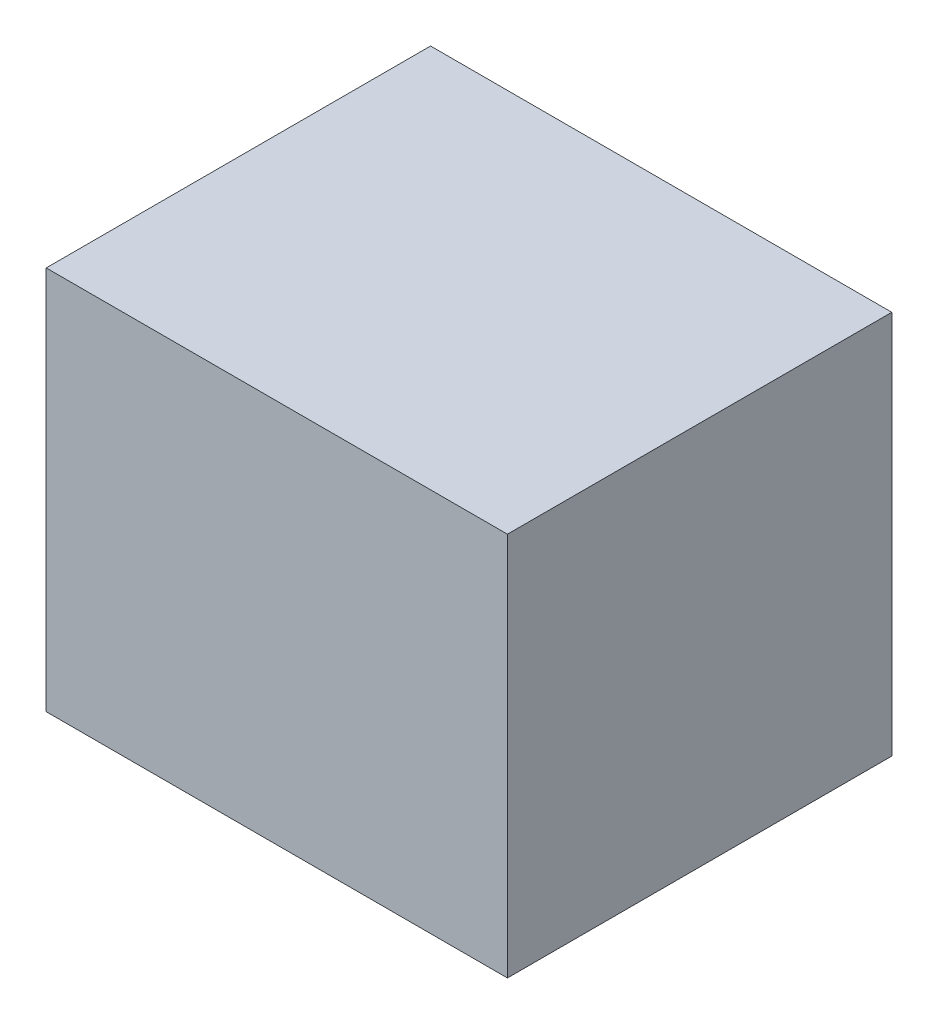
ISO-10303-21;
HEADER;
FILE_DESCRIPTION(('STEP AP214'),'2;1');
FILE_NAME('part.step','',(''),(''),'','','');
FILE_SCHEMA(('AUTOMOTIVE_DESIGN { 1 0 10303 214 1 1 1 1 }'));
ENDSEC;
DATA;
#1=APPLICATION_CONTEXT('core data for automotive mechanical design processes');
#2=APPLICATION_PROTOCOL_DEFINITION('international standard','automotive_design',2000,#1);
#3=PRODUCT_CONTEXT('',#1,'mechanical');
#4=PRODUCT('Part','Part','',(#3));
#5=PRODUCT_RELATED_PRODUCT_CATEGORY('part','',(#4));
#6=PRODUCT_DEFINITION_FORMATION('','',#4);
#7=PRODUCT_DEFINITION_CONTEXT('part definition',#1,'design');
#8=PRODUCT_DEFINITION('design','',#6,#7);
#9=PRODUCT_DEFINITION_SHAPE('','',#8);
#10=(LENGTH_UNIT() NAMED_UNIT(*) SI_UNIT(.MILLI.,.METRE.));
#11=(NAMED_UNIT(*) PLANE_ANGLE_UNIT() SI_UNIT($,.RADIAN.));
#12=(NAMED_UNIT(*) SI_UNIT($,.STERADIAN.) SOLID_ANGLE_UNIT());
#13=UNCERTAINTY_MEASURE_WITH_UNIT(LENGTH_MEASURE(1.E-05),#10,'distance_accuracy_value','');
#14=(GEOMETRIC_REPRESENTATION_CONTEXT(3) GLOBAL_UNCERTAINTY_ASSIGNED_CONTEXT((#13)) GLOBAL_UNIT_ASSIGNED_CONTEXT((#10,
#11,#12)) REPRESENTATION_CONTEXT('',''));
#15=CARTESIAN_POINT('',(0.,0.,0.));
#16=DIRECTION('',(0.,0.,1.));
#17=DIRECTION('',(1.,0.,0.));
#18=AXIS2_PLACEMENT_3D('',#15,#16,#17);
#19=CARTESIAN_POINT('',(0.,0.,500.));
#20=DIRECTION('',(1.,0.,0.));
#21=DIRECTION('',(0.,0.,-1.));
#22=AXIS2_PLACEMENT_3D('',#19,#20,#21);
#23=PLANE('',#22);
#24=DIRECTION('',(0.,-1.,0.));
#25=VECTOR('',#24,1.);
#26=CARTESIAN_POINT('',(0.,0.,0.));
#27=LINE('',#26,#25);
#28=CARTESIAN_POINT('',(0.,500.,0.));
#29=VERTEX_POINT('',#28);
#30=CARTESIAN_POINT('',(0.,0.,0.));
#31=VERTEX_POINT('',#30);
#32=EDGE_CURVE('E151',#29,#31,#27,.T.);
#33=ORIENTED_EDGE('',*,*,#32,.T.);
#34=DIRECTION('',(0.,0.,-1.));
#35=VECTOR('',#34,1.);
#36=CARTESIAN_POINT('',(0.,0.,500.));
#37=LINE('',#36,#35);
#38=CARTESIAN_POINT('',(0.,0.,500.));
#39=VERTEX_POINT('',#38);
#40=EDGE_CURVE('E140',#39,#31,#37,.T.);
#41=ORIENTED_EDGE('',*,*,#40,.F.);
#42=DIRECTION('',(0.,-1.,0.));
#43=VECTOR('',#42,1.);
#44=CARTESIAN_POINT('',(0.,0.,500.));
#45=LINE('',#44,#43);
#46=CARTESIAN_POINT('',(0.,500.,500.));
#47=VERTEX_POINT('',#46);
#48=EDGE_CURVE('E132',#47,#39,#45,.T.);
#49=ORIENTED_EDGE('',*,*,#48,.F.);
#50=DIRECTION('',(0.,0.,-1.));
#51=VECTOR('',#50,1.);
#52=CARTESIAN_POINT('',(0.,500.,500.));
#53=LINE('',#52,#51);
#54=EDGE_CURVE('E147',#47,#29,#53,.T.);
#55=ORIENTED_EDGE('',*,*,#54,.T.);
#56=EDGE_LOOP('',(#33,#41,#49,#55));
#57=FACE_BOUND('',#56,.T.);
#58=ADVANCED_FACE('F40',(#57),#23,.F.);
#59=CARTESIAN_POINT('',(0.,0.,500.));
#60=DIRECTION('',(0.,1.,0.));
#61=DIRECTION('',(0.,0.,1.));
#62=AXIS2_PLACEMENT_3D('',#59,#60,#61);
#63=PLANE('',#62);
#64=DIRECTION('',(1.,0.,0.));
#65=VECTOR('',#64,1.);
#66=CARTESIAN_POINT('',(0.,0.,0.));
#67=LINE('',#66,#65);
#68=CARTESIAN_POINT('',(600.,0.,0.));
#69=VERTEX_POINT('',#68);
#70=EDGE_CURVE('E138',#31,#69,#67,.T.);
#71=ORIENTED_EDGE('',*,*,#70,.T.);
#72=DIRECTION('',(0.,0.,-1.));
#73=VECTOR('',#72,1.);
#74=CARTESIAN_POINT('',(600.,0.,500.));
#75=LINE('',#74,#73);
#76=CARTESIAN_POINT('',(600.,0.,500.));
#77=VERTEX_POINT('',#76);
#78=EDGE_CURVE('E136',#77,#69,#75,.T.);
#79=ORIENTED_EDGE('',*,*,#78,.F.);
#80=DIRECTION('',(1.,0.,0.));
#81=VECTOR('',#80,1.);
#82=CARTESIAN_POINT('',(0.,0.,500.));
#83=LINE('',#82,#81);
#84=EDGE_CURVE('E127',#39,#77,#83,.T.);
#85=ORIENTED_EDGE('',*,*,#84,.F.);
#86=ORIENTED_EDGE('',*,*,#40,.T.);
#87=EDGE_LOOP('',(#71,#79,#85,#86));
#88=FACE_BOUND('',#87,.T.);
#89=ADVANCED_FACE('F137',(#88),#63,.F.);
#90=CARTESIAN_POINT('',(600.,0.,500.));
#91=DIRECTION('',(-1.,0.,0.));
#92=DIRECTION('',(0.,0.,1.));
#93=AXIS2_PLACEMENT_3D('',#90,#91,#92);
#94=PLANE('',#93);
#95=DIRECTION('',(0.,1.,0.));
#96=VECTOR('',#95,1.);
#97=CARTESIAN_POINT('',(600.,0.,0.));
#98=LINE('',#97,#96);
#99=CARTESIAN_POINT('',(600.,500.,0.));
#100=VERTEX_POINT('',#99);
#101=EDGE_CURVE('E113',#69,#100,#98,.T.);
#102=ORIENTED_EDGE('',*,*,#101,.T.);
#103=DIRECTION('',(0.,0.,-1.));
#104=VECTOR('',#103,1.);
#105=CARTESIAN_POINT('',(600.,500.,500.));
#106=LINE('',#105,#104);
#107=CARTESIAN_POINT('',(600.,500.,500.));
#108=VERTEX_POINT('',#107);
#109=EDGE_CURVE('E141',#108,#100,#106,.T.);
#110=ORIENTED_EDGE('',*,*,#109,.F.);
#111=DIRECTION('',(0.,1.,0.));
#112=VECTOR('',#111,1.);
#113=CARTESIAN_POINT('',(600.,0.,500.));
#114=LINE('',#113,#112);
#115=EDGE_CURVE('E130',#77,#108,#114,.T.);
#116=ORIENTED_EDGE('',*,*,#115,.F.);
#117=ORIENTED_EDGE('',*,*,#78,.T.);
#118=EDGE_LOOP('',(#102,#110,#116,#117));
#119=FACE_BOUND('',#118,.T.);
#120=ADVANCED_FACE('F143',(#119),#94,.F.);
#121=CARTESIAN_POINT('',(0.,500.,500.));
#122=DIRECTION('',(0.,-1.,0.));
#123=DIRECTION('',(0.,0.,-1.));
#124=AXIS2_PLACEMENT_3D('',#121,#122,#123);
#125=PLANE('',#124);
#126=DIRECTION('',(-1.,0.,0.));
#127=VECTOR('',#126,1.);
#128=CARTESIAN_POINT('',(0.,500.,0.));
#129=LINE('',#128,#127);
#130=EDGE_CURVE('E119',#100,#29,#129,.T.);
#131=ORIENTED_EDGE('',*,*,#130,.T.);
#132=ORIENTED_EDGE('',*,*,#54,.F.);
#133=DIRECTION('',(-1.,0.,0.));
#134=VECTOR('',#133,1.);
#135=CARTESIAN_POINT('',(0.,500.,500.));
#136=LINE('',#135,#134);
#137=EDGE_CURVE('E96',#108,#47,#136,.T.);
#138=ORIENTED_EDGE('',*,*,#137,.F.);
#139=ORIENTED_EDGE('',*,*,#109,.T.);
#140=EDGE_LOOP('',(#131,#132,#138,#139));
#141=FACE_BOUND('',#140,.T.);
#142=ADVANCED_FACE('F233',(#141),#125,.F.);
#143=CARTESIAN_POINT('',(0.,0.,500.));
#144=DIRECTION('',(0.,0.,-1.));
#145=DIRECTION('',(-1.,0.,0.));
#146=AXIS2_PLACEMENT_3D('',#143,#144,#145);
#147=PLANE('',#146);
#148=ORIENTED_EDGE('',*,*,#48,.T.);
#149=ORIENTED_EDGE('',*,*,#84,.T.);
#150=ORIENTED_EDGE('',*,*,#115,.T.);
#151=ORIENTED_EDGE('',*,*,#137,.T.);
#152=EDGE_LOOP('',(#148,#149,#150,#151));
#153=FACE_BOUND('',#152,.T.);
#154=ADVANCED_FACE('F128',(#153),#147,.F.);
#155=CARTESIAN_POINT('',(0.,0.,0.));
#156=DIRECTION('',(0.,0.,-1.));
#157=DIRECTION('',(-1.,0.,0.));
#158=AXIS2_PLACEMENT_3D('',#155,#156,#157);
#159=PLANE('',#158);
#160=ORIENTED_EDGE('',*,*,#32,.F.);
#161=ORIENTED_EDGE('',*,*,#130,.F.);
#162=ORIENTED_EDGE('',*,*,#101,.F.);
#163=ORIENTED_EDGE('',*,*,#70,.F.);
#164=EDGE_LOOP('',(#160,#161,#162,#163));
#165=FACE_BOUND('',#164,.T.);
#166=ADVANCED_FACE('F236',(#165),#159,.T.);
#167=CLOSED_SHELL('',(#58,#89,#120,#142,#154,#166));
#168=CARTESIAN_POINT('',(35.,0.,500.));
#169=DIRECTION('',(1.,0.,0.));
#170=DIRECTION('',(0.,0.,-1.));
#171=AXIS2_PLACEMENT_3D('',#168,#169,#170);
#172=PLANE('',#171);
#173=DIRECTION('',(0.,-1.,0.));
#174=VECTOR('',#173,1.);
#175=CARTESIAN_POINT('',(35.,0.,35.));
#176=LINE('',#175,#174);
#177=CARTESIAN_POINT('',(35.,465.,35.));
#178=VERTEX_POINT('',#177);
#179=CARTESIAN_POINT('',(35.,35.,35.));
#180=VERTEX_POINT('',#179);
#181=EDGE_CURVE('E44',#178,#180,#176,.T.);
#182=ORIENTED_EDGE('',*,*,#181,.F.);
#183=DIRECTION('',(0.,0.,-1.));
#184=VECTOR('',#183,1.);
#185=CARTESIAN_POINT('',(35.,465.,500.));
#186=LINE('',#185,#184);
#187=CARTESIAN_POINT('',(35.,465.,465.));
#188=VERTEX_POINT('',#187);
#189=EDGE_CURVE('E191',#188,#178,#186,.T.);
#190=ORIENTED_EDGE('',*,*,#189,.F.);
#191=DIRECTION('',(0.,-1.,0.));
#192=VECTOR('',#191,1.);
#193=CARTESIAN_POINT('',(35.,0.,465.));
#194=LINE('',#193,#192);
#195=CARTESIAN_POINT('',(35.,35.,465.));
#196=VERTEX_POINT('',#195);
#197=EDGE_CURVE('E171',#188,#196,#194,.T.);
#198=ORIENTED_EDGE('',*,*,#197,.T.);
#199=DIRECTION('',(0.,0.,-1.));
#200=VECTOR('',#199,1.);
#201=CARTESIAN_POINT('',(35.,35.,500.));
#202=LINE('',#201,#200);
#203=EDGE_CURVE('E187',#196,#180,#202,.T.);
#204=ORIENTED_EDGE('',*,*,#203,.T.);
#205=EDGE_LOOP('',(#182,#190,#198,#204));
#206=FACE_BOUND('',#205,.T.);
#207=ADVANCED_FACE('F200',(#206),#172,.T.);
#208=CARTESIAN_POINT('',(0.,35.,500.));
#209=DIRECTION('',(0.,1.,0.));
#210=DIRECTION('',(0.,0.,1.));
#211=AXIS2_PLACEMENT_3D('',#208,#209,#210);
#212=PLANE('',#211);
#213=DIRECTION('',(1.,0.,0.));
#214=VECTOR('',#213,1.);
#215=CARTESIAN_POINT('',(0.,35.,35.));
#216=LINE('',#215,#214);
#217=CARTESIAN_POINT('',(565.,35.,35.));
#218=VERTEX_POINT('',#217);
#219=EDGE_CURVE('E61',#180,#218,#216,.T.);
#220=ORIENTED_EDGE('',*,*,#219,.F.);
#221=ORIENTED_EDGE('',*,*,#203,.F.);
#222=DIRECTION('',(1.,0.,0.));
#223=VECTOR('',#222,1.);
#224=CARTESIAN_POINT('',(0.,35.,465.));
#225=LINE('',#224,#223);
#226=CARTESIAN_POINT('',(565.,35.,465.));
#227=VERTEX_POINT('',#226);
#228=EDGE_CURVE('E84',#196,#227,#225,.T.);
#229=ORIENTED_EDGE('',*,*,#228,.T.);
#230=DIRECTION('',(0.,0.,-1.));
#231=VECTOR('',#230,1.);
#232=CARTESIAN_POINT('',(565.,35.,500.));
#233=LINE('',#232,#231);
#234=EDGE_CURVE('E181',#227,#218,#233,.T.);
#235=ORIENTED_EDGE('',*,*,#234,.T.);
#236=EDGE_LOOP('',(#220,#221,#229,#235));
#237=FACE_BOUND('',#236,.T.);
#238=ADVANCED_FACE('F201',(#237),#212,.T.);
#239=CARTESIAN_POINT('',(565.,0.,500.));
#240=DIRECTION('',(-1.,0.,0.));
#241=DIRECTION('',(0.,0.,1.));
#242=AXIS2_PLACEMENT_3D('',#239,#240,#241);
#243=PLANE('',#242);
#244=DIRECTION('',(0.,1.,0.));
#245=VECTOR('',#244,1.);
#246=CARTESIAN_POINT('',(565.,0.,35.));
#247=LINE('',#246,#245);
#248=CARTESIAN_POINT('',(565.,465.,35.));
#249=VERTEX_POINT('',#248);
#250=EDGE_CURVE('E184',#218,#249,#247,.T.);
#251=ORIENTED_EDGE('',*,*,#250,.F.);
#252=ORIENTED_EDGE('',*,*,#234,.F.);
#253=DIRECTION('',(0.,1.,0.));
#254=VECTOR('',#253,1.);
#255=CARTESIAN_POINT('',(565.,0.,465.));
#256=LINE('',#255,#254);
#257=CARTESIAN_POINT('',(565.,465.,465.));
#258=VERTEX_POINT('',#257);
#259=EDGE_CURVE('E52',#227,#258,#256,.T.);
#260=ORIENTED_EDGE('',*,*,#259,.T.);
#261=DIRECTION('',(0.,0.,-1.));
#262=VECTOR('',#261,1.);
#263=CARTESIAN_POINT('',(565.,465.,500.));
#264=LINE('',#263,#262);
#265=EDGE_CURVE('E174',#258,#249,#264,.T.);
#266=ORIENTED_EDGE('',*,*,#265,.T.);
#267=EDGE_LOOP('',(#251,#252,#260,#266));
#268=FACE_BOUND('',#267,.T.);
#269=ADVANCED_FACE('F205',(#268),#243,.T.);
#270=CARTESIAN_POINT('',(0.,465.,500.));
#271=DIRECTION('',(0.,-1.,0.));
#272=DIRECTION('',(0.,0.,-1.));
#273=AXIS2_PLACEMENT_3D('',#270,#271,#272);
#274=PLANE('',#273);
#275=DIRECTION('',(-1.,0.,0.));
#276=VECTOR('',#275,1.);
#277=CARTESIAN_POINT('',(0.,465.,35.));
#278=LINE('',#277,#276);
#279=EDGE_CURVE('E178',#249,#178,#278,.T.);
#280=ORIENTED_EDGE('',*,*,#279,.F.);
#281=ORIENTED_EDGE('',*,*,#265,.F.);
#282=DIRECTION('',(-1.,0.,0.));
#283=VECTOR('',#282,1.);
#284=CARTESIAN_POINT('',(0.,465.,465.));
#285=LINE('',#284,#283);
#286=EDGE_CURVE('E11',#258,#188,#285,.T.);
#287=ORIENTED_EDGE('',*,*,#286,.T.);
#288=ORIENTED_EDGE('',*,*,#189,.T.);
#289=EDGE_LOOP('',(#280,#281,#287,#288));
#290=FACE_BOUND('',#289,.T.);
#291=ADVANCED_FACE('F209',(#290),#274,.T.);
#292=CARTESIAN_POINT('',(0.,0.,465.));
#293=DIRECTION('',(0.,0.,-1.));
#294=DIRECTION('',(-1.,0.,0.));
#295=AXIS2_PLACEMENT_3D('',#292,#293,#294);
#296=PLANE('',#295);
#297=ORIENTED_EDGE('',*,*,#197,.F.);
#298=ORIENTED_EDGE('',*,*,#286,.F.);
#299=ORIENTED_EDGE('',*,*,#259,.F.);
#300=ORIENTED_EDGE('',*,*,#228,.F.);
#301=EDGE_LOOP('',(#297,#298,#299,#300));
#302=FACE_BOUND('',#301,.T.);
#303=ADVANCED_FACE('F208',(#302),#296,.T.);
#304=CARTESIAN_POINT('',(0.,0.,35.));
#305=DIRECTION('',(0.,0.,-1.));
#306=DIRECTION('',(-1.,0.,0.));
#307=AXIS2_PLACEMENT_3D('',#304,#305,#306);
#308=PLANE('',#307);
#309=ORIENTED_EDGE('',*,*,#181,.T.);
#310=ORIENTED_EDGE('',*,*,#219,.T.);
#311=ORIENTED_EDGE('',*,*,#250,.T.);
#312=ORIENTED_EDGE('',*,*,#279,.T.);
#313=EDGE_LOOP('',(#309,#310,#311,#312));
#314=FACE_BOUND('',#313,.T.);
#315=ADVANCED_FACE('F42',(#314),#308,.F.);
#316=CLOSED_SHELL('',(#207,#238,#269,#291,#303,#315));
#317=ORIENTED_CLOSED_SHELL('',*,#316,.T.);
#318=BREP_WITH_VOIDS('B2',#167,(#317));
#319=ADVANCED_BREP_SHAPE_REPRESENTATION('',(#18,#318),#14);
#320=SHAPE_DEFINITION_REPRESENTATION(#9,#319);
ENDSEC;
END-ISO-10303-21;
